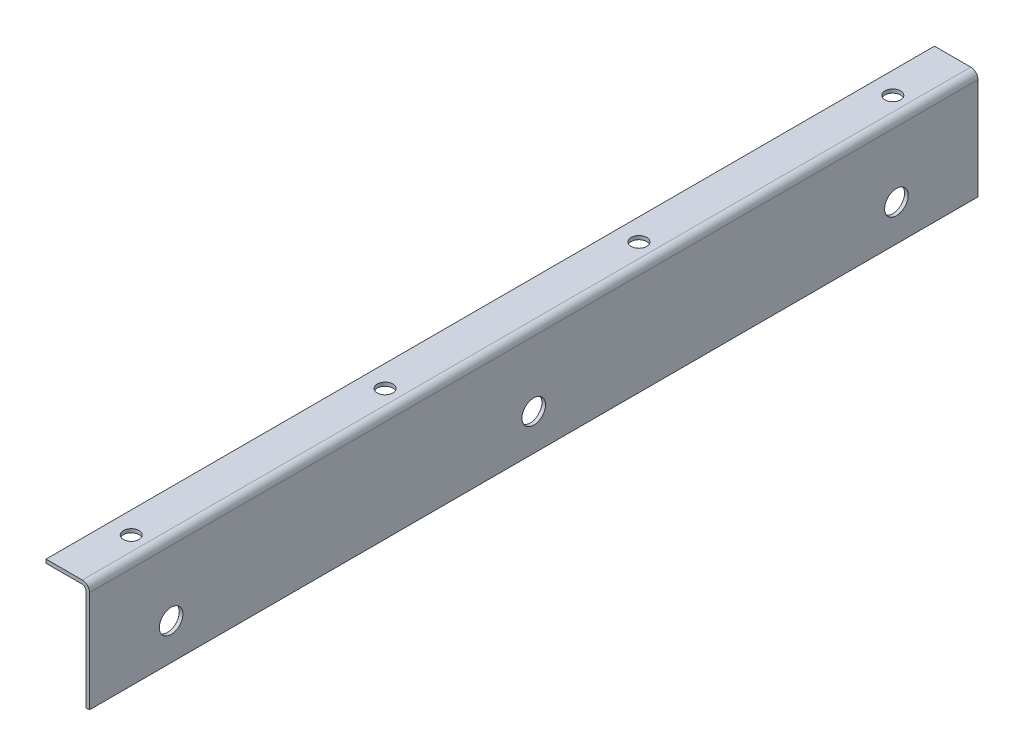
ISO-10303-21;
HEADER;
FILE_DESCRIPTION(('STEP AP214'),'2;1');
FILE_NAME('part.step','',(''),(''),'','','');
FILE_SCHEMA(('AUTOMOTIVE_DESIGN { 1 0 10303 214 1 1 1 1 }'));
ENDSEC;
DATA;
#1=APPLICATION_CONTEXT('core data for automotive mechanical design processes');
#2=APPLICATION_PROTOCOL_DEFINITION('international standard','automotive_design',2000,#1);
#3=PRODUCT_CONTEXT('',#1,'mechanical');
#4=PRODUCT('Part','Part','',(#3));
#5=PRODUCT_RELATED_PRODUCT_CATEGORY('part','',(#4));
#6=PRODUCT_DEFINITION_FORMATION('','',#4);
#7=PRODUCT_DEFINITION_CONTEXT('part definition',#1,'design');
#8=PRODUCT_DEFINITION('design','',#6,#7);
#9=PRODUCT_DEFINITION_SHAPE('','',#8);
#10=(LENGTH_UNIT() NAMED_UNIT(*) SI_UNIT(.MILLI.,.METRE.));
#11=(NAMED_UNIT(*) PLANE_ANGLE_UNIT() SI_UNIT($,.RADIAN.));
#12=(NAMED_UNIT(*) SI_UNIT($,.STERADIAN.) SOLID_ANGLE_UNIT());
#13=UNCERTAINTY_MEASURE_WITH_UNIT(LENGTH_MEASURE(1.E-05),#10,'distance_accuracy_value','');
#14=(GEOMETRIC_REPRESENTATION_CONTEXT(3) GLOBAL_UNCERTAINTY_ASSIGNED_CONTEXT((#13)) GLOBAL_UNIT_ASSIGNED_CONTEXT((#10,
#11,#12)) REPRESENTATION_CONTEXT('',''));
#15=CARTESIAN_POINT('',(0.,0.,0.));
#16=DIRECTION('',(0.,0.,1.));
#17=DIRECTION('',(1.,0.,0.));
#18=AXIS2_PLACEMENT_3D('',#15,#16,#17);
#19=CARTESIAN_POINT('',(-2.,-2.,245.));
#20=DIRECTION('',(0.,0.,-1.));
#21=DIRECTION('',(-1.,0.,0.));
#22=AXIS2_PLACEMENT_3D('',#19,#20,#21);
#23=CYLINDRICAL_SURFACE('',#22,2.);
#24=CARTESIAN_POINT('',(-2.,-2.,0.));
#25=DIRECTION('',(0.,0.,1.));
#26=DIRECTION('',(-1.,0.,0.));
#27=AXIS2_PLACEMENT_3D('',#24,#25,#26);
#28=CIRCLE('',#27,2.);
#29=CARTESIAN_POINT('',(0.,-2.00000000000001,0.));
#30=VERTEX_POINT('',#29);
#31=CARTESIAN_POINT('',(-2.00000000000001,0.,0.));
#32=VERTEX_POINT('',#31);
#33=EDGE_CURVE('E129',#30,#32,#28,.T.);
#34=ORIENTED_EDGE('',*,*,#33,.T.);
#35=DIRECTION('',(0.,0.,-1.));
#36=VECTOR('',#35,1.);
#37=CARTESIAN_POINT('',(-2.00000000000001,0.,245.));
#38=LINE('',#37,#36);
#39=CARTESIAN_POINT('',(-2.00000000000001,0.,245.));
#40=VERTEX_POINT('',#39);
#41=EDGE_CURVE('E11',#40,#32,#38,.T.);
#42=ORIENTED_EDGE('',*,*,#41,.F.);
#43=CARTESIAN_POINT('',(-2.,-2.,245.));
#44=DIRECTION('',(0.,0.,1.));
#45=DIRECTION('',(-1.,0.,0.));
#46=AXIS2_PLACEMENT_3D('',#43,#44,#45);
#47=CIRCLE('',#46,2.);
#48=CARTESIAN_POINT('',(0.,-2.00000000000001,245.));
#49=VERTEX_POINT('',#48);
#50=EDGE_CURVE('E144',#49,#40,#47,.T.);
#51=ORIENTED_EDGE('',*,*,#50,.F.);
#52=DIRECTION('',(0.,0.,-1.));
#53=VECTOR('',#52,1.);
#54=CARTESIAN_POINT('',(0.,-2.00000000000001,245.));
#55=LINE('',#54,#53);
#56=EDGE_CURVE('E125',#49,#30,#55,.T.);
#57=ORIENTED_EDGE('',*,*,#56,.T.);
#58=EDGE_LOOP('',(#34,#42,#51,#57));
#59=FACE_BOUND('',#58,.T.);
#60=ADVANCED_FACE('F31',(#59),#23,.T.);
#61=CARTESIAN_POINT('',(-2.00000000000001,0.,245.));
#62=DIRECTION('',(0.,-1.,0.));
#63=DIRECTION('',(1.,0.,0.));
#64=AXIS2_PLACEMENT_3D('',#61,#62,#63);
#65=PLANE('',#64);
#66=CARTESIAN_POINT('',(-5.99999999999997,0.,227.5));
#67=DIRECTION('',(0.,1.,0.));
#68=DIRECTION('',(-1.,0.,0.));
#69=AXIS2_PLACEMENT_3D('',#66,#67,#68);
#70=CIRCLE('',#69,2.15000000000001);
#71=CARTESIAN_POINT('',(-8.14999999999998,0.,227.5));
#72=VERTEX_POINT('',#71);
#73=EDGE_CURVE('E174',#72,#72,#70,.T.);
#74=ORIENTED_EDGE('',*,*,#73,.F.);
#75=EDGE_LOOP('',(#74));
#76=FACE_BOUND('',#75,.T.);
#77=CARTESIAN_POINT('',(-5.99999999999998,0.,157.5));
#78=DIRECTION('',(0.,1.,0.));
#79=DIRECTION('',(-1.,0.,0.));
#80=AXIS2_PLACEMENT_3D('',#77,#78,#79);
#81=CIRCLE('',#80,2.15000000000001);
#82=CARTESIAN_POINT('',(-8.14999999999999,0.,157.5));
#83=VERTEX_POINT('',#82);
#84=EDGE_CURVE('E164',#83,#83,#81,.T.);
#85=ORIENTED_EDGE('',*,*,#84,.F.);
#86=EDGE_LOOP('',(#85));
#87=FACE_BOUND('',#86,.T.);
#88=CARTESIAN_POINT('',(-5.99999999999999,0.,87.5));
#89=DIRECTION('',(0.,1.,0.));
#90=DIRECTION('',(-1.,0.,0.));
#91=AXIS2_PLACEMENT_3D('',#88,#89,#90);
#92=CIRCLE('',#91,2.15);
#93=CARTESIAN_POINT('',(-8.14999999999999,0.,87.5));
#94=VERTEX_POINT('',#93);
#95=EDGE_CURVE('E161',#94,#94,#92,.T.);
#96=ORIENTED_EDGE('',*,*,#95,.F.);
#97=EDGE_LOOP('',(#96));
#98=FACE_BOUND('',#97,.T.);
#99=CARTESIAN_POINT('',(-6.,0.,17.5));
#100=DIRECTION('',(0.,1.,0.));
#101=DIRECTION('',(-1.,0.,0.));
#102=AXIS2_PLACEMENT_3D('',#99,#100,#101);
#103=CIRCLE('',#102,2.15);
#104=CARTESIAN_POINT('',(-8.14999999999999,0.,17.5));
#105=VERTEX_POINT('',#104);
#106=EDGE_CURVE('E158',#105,#105,#103,.T.);
#107=ORIENTED_EDGE('',*,*,#106,.F.);
#108=EDGE_LOOP('',(#107));
#109=FACE_BOUND('',#108,.T.);
#110=DIRECTION('',(-1.,0.,0.));
#111=VECTOR('',#110,1.);
#112=CARTESIAN_POINT('',(-2.00000000000001,0.,0.));
#113=LINE('',#112,#111);
#114=CARTESIAN_POINT('',(-12.,0.,0.));
#115=VERTEX_POINT('',#114);
#116=EDGE_CURVE('E132',#32,#115,#113,.T.);
#117=ORIENTED_EDGE('',*,*,#116,.T.);
#118=DIRECTION('',(0.,0.,-1.));
#119=VECTOR('',#118,1.);
#120=CARTESIAN_POINT('',(-12.,0.,245.));
#121=LINE('',#120,#119);
#122=CARTESIAN_POINT('',(-12.,0.,245.));
#123=VERTEX_POINT('',#122);
#124=EDGE_CURVE('E40',#123,#115,#121,.T.);
#125=ORIENTED_EDGE('',*,*,#124,.F.);
#126=DIRECTION('',(-1.,0.,0.));
#127=VECTOR('',#126,1.);
#128=CARTESIAN_POINT('',(-2.00000000000001,0.,245.));
#129=LINE('',#128,#127);
#130=EDGE_CURVE('E92',#40,#123,#129,.T.);
#131=ORIENTED_EDGE('',*,*,#130,.F.);
#132=ORIENTED_EDGE('',*,*,#41,.T.);
#133=EDGE_LOOP('',(#117,#125,#131,#132));
#134=FACE_BOUND('',#133,.T.);
#135=ADVANCED_FACE('F216',(#76,#87,#98,#109,#134),#65,.F.);
#136=CARTESIAN_POINT('',(-12.,0.,245.));
#137=DIRECTION('',(1.,0.,0.));
#138=DIRECTION('',(0.,0.,-1.));
#139=AXIS2_PLACEMENT_3D('',#136,#137,#138);
#140=PLANE('',#139);
#141=DIRECTION('',(0.,-1.,0.));
#142=VECTOR('',#141,1.);
#143=CARTESIAN_POINT('',(-12.,0.,0.));
#144=LINE('',#143,#142);
#145=CARTESIAN_POINT('',(-12.,-1.,0.));
#146=VERTEX_POINT('',#145);
#147=EDGE_CURVE('E135',#115,#146,#144,.T.);
#148=ORIENTED_EDGE('',*,*,#147,.T.);
#149=DIRECTION('',(0.,0.,-1.));
#150=VECTOR('',#149,1.);
#151=CARTESIAN_POINT('',(-12.,-1.,245.));
#152=LINE('',#151,#150);
#153=CARTESIAN_POINT('',(-12.,-1.,245.));
#154=VERTEX_POINT('',#153);
#155=EDGE_CURVE('E151',#154,#146,#152,.T.);
#156=ORIENTED_EDGE('',*,*,#155,.F.);
#157=DIRECTION('',(0.,-1.,0.));
#158=VECTOR('',#157,1.);
#159=CARTESIAN_POINT('',(-12.,0.,245.));
#160=LINE('',#159,#158);
#161=EDGE_CURVE('E182',#123,#154,#160,.T.);
#162=ORIENTED_EDGE('',*,*,#161,.F.);
#163=ORIENTED_EDGE('',*,*,#124,.T.);
#164=EDGE_LOOP('',(#148,#156,#162,#163));
#165=FACE_BOUND('',#164,.T.);
#166=ADVANCED_FACE('F220',(#165),#140,.F.);
#167=CARTESIAN_POINT('',(-2.00000000000001,-1.,245.));
#168=DIRECTION('',(0.,1.,0.));
#169=DIRECTION('',(-1.,0.,0.));
#170=AXIS2_PLACEMENT_3D('',#167,#168,#169);
#171=PLANE('',#170);
#172=CARTESIAN_POINT('',(-5.99999999999997,-1.,227.5));
#173=DIRECTION('',(0.,1.,0.));
#174=DIRECTION('',(-1.,0.,0.));
#175=AXIS2_PLACEMENT_3D('',#172,#173,#174);
#176=CIRCLE('',#175,2.15000000000001);
#177=CARTESIAN_POINT('',(-8.14999999999998,-1.,227.5));
#178=VERTEX_POINT('',#177);
#179=EDGE_CURVE('E34',#178,#178,#176,.T.);
#180=ORIENTED_EDGE('',*,*,#179,.T.);
#181=EDGE_LOOP('',(#180));
#182=FACE_BOUND('',#181,.T.);
#183=CARTESIAN_POINT('',(-5.99999999999998,-1.,157.5));
#184=DIRECTION('',(0.,1.,0.));
#185=DIRECTION('',(-1.,0.,0.));
#186=AXIS2_PLACEMENT_3D('',#183,#184,#185);
#187=CIRCLE('',#186,2.15000000000001);
#188=CARTESIAN_POINT('',(-8.14999999999999,-1.,157.5));
#189=VERTEX_POINT('',#188);
#190=EDGE_CURVE('E162',#189,#189,#187,.T.);
#191=ORIENTED_EDGE('',*,*,#190,.T.);
#192=EDGE_LOOP('',(#191));
#193=FACE_BOUND('',#192,.T.);
#194=CARTESIAN_POINT('',(-5.99999999999999,-1.,87.5));
#195=DIRECTION('',(0.,1.,0.));
#196=DIRECTION('',(-1.,0.,0.));
#197=AXIS2_PLACEMENT_3D('',#194,#195,#196);
#198=CIRCLE('',#197,2.15);
#199=CARTESIAN_POINT('',(-8.14999999999999,-1.,87.5));
#200=VERTEX_POINT('',#199);
#201=EDGE_CURVE('E159',#200,#200,#198,.T.);
#202=ORIENTED_EDGE('',*,*,#201,.T.);
#203=EDGE_LOOP('',(#202));
#204=FACE_BOUND('',#203,.T.);
#205=CARTESIAN_POINT('',(-5.99999999999999,-1.,17.5));
#206=DIRECTION('',(0.,1.,0.));
#207=DIRECTION('',(-1.,0.,0.));
#208=AXIS2_PLACEMENT_3D('',#205,#206,#207);
#209=CIRCLE('',#208,2.15);
#210=CARTESIAN_POINT('',(-8.14999999999999,-1.,17.5));
#211=VERTEX_POINT('',#210);
#212=EDGE_CURVE('E133',#211,#211,#209,.T.);
#213=ORIENTED_EDGE('',*,*,#212,.T.);
#214=EDGE_LOOP('',(#213));
#215=FACE_BOUND('',#214,.T.);
#216=DIRECTION('',(1.,0.,0.));
#217=VECTOR('',#216,1.);
#218=CARTESIAN_POINT('',(-2.00000000000001,-1.,0.));
#219=LINE('',#218,#217);
#220=CARTESIAN_POINT('',(-2.00000000000001,-1.,0.));
#221=VERTEX_POINT('',#220);
#222=EDGE_CURVE('E137',#146,#221,#219,.T.);
#223=ORIENTED_EDGE('',*,*,#222,.T.);
#224=DIRECTION('',(0.,0.,-1.));
#225=VECTOR('',#224,1.);
#226=CARTESIAN_POINT('',(-2.00000000000001,-1.,245.));
#227=LINE('',#226,#225);
#228=CARTESIAN_POINT('',(-2.00000000000001,-1.,245.));
#229=VERTEX_POINT('',#228);
#230=EDGE_CURVE('E148',#229,#221,#227,.T.);
#231=ORIENTED_EDGE('',*,*,#230,.F.);
#232=DIRECTION('',(1.,0.,0.));
#233=VECTOR('',#232,1.);
#234=CARTESIAN_POINT('',(-2.00000000000001,-1.,245.));
#235=LINE('',#234,#233);
#236=EDGE_CURVE('E184',#154,#229,#235,.T.);
#237=ORIENTED_EDGE('',*,*,#236,.F.);
#238=ORIENTED_EDGE('',*,*,#155,.T.);
#239=EDGE_LOOP('',(#223,#231,#237,#238));
#240=FACE_BOUND('',#239,.T.);
#241=ADVANCED_FACE('F190',(#182,#193,#204,#215,#240),#171,.F.);
#242=CARTESIAN_POINT('',(-2.,-2.,245.));
#243=DIRECTION('',(0.,0.,-1.));
#244=DIRECTION('',(-1.,0.,0.));
#245=AXIS2_PLACEMENT_3D('',#242,#243,#244);
#246=CYLINDRICAL_SURFACE('',#245,1.);
#247=CARTESIAN_POINT('',(-2.,-2.,0.));
#248=DIRECTION('',(0.,0.,-1.));
#249=DIRECTION('',(-1.,0.,0.));
#250=AXIS2_PLACEMENT_3D('',#247,#248,#249);
#251=CIRCLE('',#250,1.);
#252=CARTESIAN_POINT('',(-1.,-2.00000000000001,0.));
#253=VERTEX_POINT('',#252);
#254=EDGE_CURVE('E139',#221,#253,#251,.T.);
#255=ORIENTED_EDGE('',*,*,#254,.T.);
#256=DIRECTION('',(0.,0.,-1.));
#257=VECTOR('',#256,1.);
#258=CARTESIAN_POINT('',(-1.,-2.00000000000001,245.));
#259=LINE('',#258,#257);
#260=CARTESIAN_POINT('',(-1.,-2.00000000000001,245.));
#261=VERTEX_POINT('',#260);
#262=EDGE_CURVE('E120',#261,#253,#259,.T.);
#263=ORIENTED_EDGE('',*,*,#262,.F.);
#264=CARTESIAN_POINT('',(-2.,-2.,245.));
#265=DIRECTION('',(0.,0.,-1.));
#266=DIRECTION('',(-1.,0.,0.));
#267=AXIS2_PLACEMENT_3D('',#264,#265,#266);
#268=CIRCLE('',#267,1.);
#269=EDGE_CURVE('E111',#229,#261,#268,.T.);
#270=ORIENTED_EDGE('',*,*,#269,.F.);
#271=ORIENTED_EDGE('',*,*,#230,.T.);
#272=EDGE_LOOP('',(#255,#263,#270,#271));
#273=FACE_BOUND('',#272,.T.);
#274=ADVANCED_FACE('F194',(#273),#246,.F.);
#275=CARTESIAN_POINT('',(-1.,-2.00000000000001,245.));
#276=DIRECTION('',(1.,0.,0.));
#277=DIRECTION('',(0.,0.,-1.));
#278=AXIS2_PLACEMENT_3D('',#275,#276,#277);
#279=PLANE('',#278);
#280=CARTESIAN_POINT('',(-1.,-20.,222.5));
#281=DIRECTION('',(1.,0.,0.));
#282=DIRECTION('',(0.,0.,-1.));
#283=AXIS2_PLACEMENT_3D('',#280,#281,#282);
#284=CIRCLE('',#283,3.24999999999998);
#285=CARTESIAN_POINT('',(-1.,-20.,219.25));
#286=VERTEX_POINT('',#285);
#287=EDGE_CURVE('E242',#286,#286,#284,.T.);
#288=ORIENTED_EDGE('',*,*,#287,.T.);
#289=EDGE_LOOP('',(#288));
#290=FACE_BOUND('',#289,.T.);
#291=CARTESIAN_POINT('',(-1.,-20.,22.5));
#292=DIRECTION('',(1.,0.,0.));
#293=DIRECTION('',(0.,0.,-1.));
#294=AXIS2_PLACEMENT_3D('',#291,#292,#293);
#295=CIRCLE('',#294,3.25);
#296=CARTESIAN_POINT('',(-1.,-20.,19.25));
#297=VERTEX_POINT('',#296);
#298=EDGE_CURVE('E246',#297,#297,#295,.T.);
#299=ORIENTED_EDGE('',*,*,#298,.T.);
#300=EDGE_LOOP('',(#299));
#301=FACE_BOUND('',#300,.T.);
#302=CARTESIAN_POINT('',(-1.,-20.,122.5));
#303=DIRECTION('',(1.,0.,0.));
#304=DIRECTION('',(0.,0.,-1.));
#305=AXIS2_PLACEMENT_3D('',#302,#303,#304);
#306=CIRCLE('',#305,3.25000000000001);
#307=CARTESIAN_POINT('',(-1.,-20.,119.25));
#308=VERTEX_POINT('',#307);
#309=EDGE_CURVE('E249',#308,#308,#306,.T.);
#310=ORIENTED_EDGE('',*,*,#309,.T.);
#311=EDGE_LOOP('',(#310));
#312=FACE_BOUND('',#311,.T.);
#313=DIRECTION('',(0.,-1.,0.));
#314=VECTOR('',#313,1.);
#315=CARTESIAN_POINT('',(-1.,-2.00000000000001,0.));
#316=LINE('',#315,#314);
#317=CARTESIAN_POINT('',(-1.,-30.,0.));
#318=VERTEX_POINT('',#317);
#319=EDGE_CURVE('E119',#253,#318,#316,.T.);
#320=ORIENTED_EDGE('',*,*,#319,.T.);
#321=DIRECTION('',(0.,0.,-1.));
#322=VECTOR('',#321,1.);
#323=CARTESIAN_POINT('',(-1.,-30.,245.));
#324=LINE('',#323,#322);
#325=CARTESIAN_POINT('',(-1.,-30.,245.));
#326=VERTEX_POINT('',#325);
#327=EDGE_CURVE('E116',#326,#318,#324,.T.);
#328=ORIENTED_EDGE('',*,*,#327,.F.);
#329=DIRECTION('',(0.,-1.,0.));
#330=VECTOR('',#329,1.);
#331=CARTESIAN_POINT('',(-1.,-2.00000000000001,245.));
#332=LINE('',#331,#330);
#333=EDGE_CURVE('E105',#261,#326,#332,.T.);
#334=ORIENTED_EDGE('',*,*,#333,.F.);
#335=ORIENTED_EDGE('',*,*,#262,.T.);
#336=EDGE_LOOP('',(#320,#328,#334,#335));
#337=FACE_BOUND('',#336,.T.);
#338=ADVANCED_FACE('F117',(#290,#301,#312,#337),#279,.F.);
#339=CARTESIAN_POINT('',(-1.,-30.,245.));
#340=DIRECTION('',(0.,1.,0.));
#341=DIRECTION('',(0.,0.,1.));
#342=AXIS2_PLACEMENT_3D('',#339,#340,#341);
#343=PLANE('',#342);
#344=DIRECTION('',(1.,0.,0.));
#345=VECTOR('',#344,1.);
#346=CARTESIAN_POINT('',(-1.,-30.,0.));
#347=LINE('',#346,#345);
#348=CARTESIAN_POINT('',(0.,-30.,0.));
#349=VERTEX_POINT('',#348);
#350=EDGE_CURVE('E78',#318,#349,#347,.T.);
#351=ORIENTED_EDGE('',*,*,#350,.T.);
#352=DIRECTION('',(0.,0.,-1.));
#353=VECTOR('',#352,1.);
#354=CARTESIAN_POINT('',(0.,-30.,245.));
#355=LINE('',#354,#353);
#356=CARTESIAN_POINT('',(0.,-30.,245.));
#357=VERTEX_POINT('',#356);
#358=EDGE_CURVE('E121',#357,#349,#355,.T.);
#359=ORIENTED_EDGE('',*,*,#358,.F.);
#360=DIRECTION('',(1.,0.,0.));
#361=VECTOR('',#360,1.);
#362=CARTESIAN_POINT('',(-1.,-30.,245.));
#363=LINE('',#362,#361);
#364=EDGE_CURVE('E109',#326,#357,#363,.T.);
#365=ORIENTED_EDGE('',*,*,#364,.F.);
#366=ORIENTED_EDGE('',*,*,#327,.T.);
#367=EDGE_LOOP('',(#351,#359,#365,#366));
#368=FACE_BOUND('',#367,.T.);
#369=ADVANCED_FACE('F123',(#368),#343,.F.);
#370=CARTESIAN_POINT('',(0.,-2.00000000000001,245.));
#371=DIRECTION('',(-1.,0.,0.));
#372=DIRECTION('',(0.,-1.,0.));
#373=AXIS2_PLACEMENT_3D('',#370,#371,#372);
#374=PLANE('',#373);
#375=CARTESIAN_POINT('',(0.,-20.,222.5));
#376=DIRECTION('',(1.,0.,0.));
#377=DIRECTION('',(0.,-1.,0.));
#378=AXIS2_PLACEMENT_3D('',#375,#376,#377);
#379=CIRCLE('',#378,3.24999999999998);
#380=CARTESIAN_POINT('',(0.,-23.25,222.5));
#381=VERTEX_POINT('',#380);
#382=EDGE_CURVE('E261',#381,#381,#379,.T.);
#383=ORIENTED_EDGE('',*,*,#382,.F.);
#384=EDGE_LOOP('',(#383));
#385=FACE_BOUND('',#384,.T.);
#386=CARTESIAN_POINT('',(0.,-20.,22.5));
#387=DIRECTION('',(1.,0.,0.));
#388=DIRECTION('',(0.,1.,0.));
#389=AXIS2_PLACEMENT_3D('',#386,#387,#388);
#390=CIRCLE('',#389,3.25);
#391=CARTESIAN_POINT('',(0.,-16.75,22.5));
#392=VERTEX_POINT('',#391);
#393=EDGE_CURVE('E257',#392,#392,#390,.T.);
#394=ORIENTED_EDGE('',*,*,#393,.F.);
#395=EDGE_LOOP('',(#394));
#396=FACE_BOUND('',#395,.T.);
#397=CARTESIAN_POINT('',(0.,-20.,122.5));
#398=DIRECTION('',(1.,0.,0.));
#399=DIRECTION('',(0.,1.,0.));
#400=AXIS2_PLACEMENT_3D('',#397,#398,#399);
#401=CIRCLE('',#400,3.25000000000001);
#402=CARTESIAN_POINT('',(0.,-16.75,122.5));
#403=VERTEX_POINT('',#402);
#404=EDGE_CURVE('E251',#403,#403,#401,.T.);
#405=ORIENTED_EDGE('',*,*,#404,.F.);
#406=EDGE_LOOP('',(#405));
#407=FACE_BOUND('',#406,.T.);
#408=DIRECTION('',(0.,1.,0.));
#409=VECTOR('',#408,1.);
#410=CARTESIAN_POINT('',(0.,-2.00000000000001,0.));
#411=LINE('',#410,#409);
#412=EDGE_CURVE('E84',#349,#30,#411,.T.);
#413=ORIENTED_EDGE('',*,*,#412,.T.);
#414=ORIENTED_EDGE('',*,*,#56,.F.);
#415=DIRECTION('',(0.,1.,0.));
#416=VECTOR('',#415,1.);
#417=CARTESIAN_POINT('',(0.,-2.00000000000001,245.));
#418=LINE('',#417,#416);
#419=EDGE_CURVE('E49',#357,#49,#418,.T.);
#420=ORIENTED_EDGE('',*,*,#419,.F.);
#421=ORIENTED_EDGE('',*,*,#358,.T.);
#422=EDGE_LOOP('',(#413,#414,#420,#421));
#423=FACE_BOUND('',#422,.T.);
#424=ADVANCED_FACE('F202',(#385,#396,#407,#423),#374,.F.);
#425=CARTESIAN_POINT('',(-2.,-2.,245.));
#426=DIRECTION('',(0.,0.,-1.));
#427=DIRECTION('',(-1.,0.,0.));
#428=AXIS2_PLACEMENT_3D('',#425,#426,#427);
#429=PLANE('',#428);
#430=ORIENTED_EDGE('',*,*,#50,.T.);
#431=ORIENTED_EDGE('',*,*,#130,.T.);
#432=ORIENTED_EDGE('',*,*,#161,.T.);
#433=ORIENTED_EDGE('',*,*,#236,.T.);
#434=ORIENTED_EDGE('',*,*,#269,.T.);
#435=ORIENTED_EDGE('',*,*,#333,.T.);
#436=ORIENTED_EDGE('',*,*,#364,.T.);
#437=ORIENTED_EDGE('',*,*,#419,.T.);
#438=EDGE_LOOP('',(#430,#431,#432,#433,#434,#435,#436,#437));
#439=FACE_BOUND('',#438,.T.);
#440=ADVANCED_FACE('F107',(#439),#429,.F.);
#441=CARTESIAN_POINT('',(-2.,-2.,0.));
#442=DIRECTION('',(0.,0.,-1.));
#443=DIRECTION('',(-1.,0.,0.));
#444=AXIS2_PLACEMENT_3D('',#441,#442,#443);
#445=PLANE('',#444);
#446=ORIENTED_EDGE('',*,*,#33,.F.);
#447=ORIENTED_EDGE('',*,*,#412,.F.);
#448=ORIENTED_EDGE('',*,*,#350,.F.);
#449=ORIENTED_EDGE('',*,*,#319,.F.);
#450=ORIENTED_EDGE('',*,*,#254,.F.);
#451=ORIENTED_EDGE('',*,*,#222,.F.);
#452=ORIENTED_EDGE('',*,*,#147,.F.);
#453=ORIENTED_EDGE('',*,*,#116,.F.);
#454=EDGE_LOOP('',(#446,#447,#448,#449,#450,#451,#452,#453));
#455=FACE_BOUND('',#454,.T.);
#456=ADVANCED_FACE('F197',(#455),#445,.T.);
#457=CARTESIAN_POINT('',(-5.99999999999997,-245.,17.5));
#458=DIRECTION('',(0.,1.,0.));
#459=DIRECTION('',(-1.,0.,0.));
#460=AXIS2_PLACEMENT_3D('',#457,#458,#459);
#461=CYLINDRICAL_SURFACE('',#460,2.15);
#462=ORIENTED_EDGE('',*,*,#106,.T.);
#463=EDGE_LOOP('',(#462));
#464=FACE_BOUND('',#463,.T.);
#465=ORIENTED_EDGE('',*,*,#212,.F.);
#466=EDGE_LOOP('',(#465));
#467=FACE_BOUND('',#466,.T.);
#468=ADVANCED_FACE('F289',(#464,#467),#461,.F.);
#469=CARTESIAN_POINT('',(-5.99999999999996,-245.,87.5));
#470=DIRECTION('',(0.,1.,0.));
#471=DIRECTION('',(-1.,0.,0.));
#472=AXIS2_PLACEMENT_3D('',#469,#470,#471);
#473=CYLINDRICAL_SURFACE('',#472,2.15);
#474=ORIENTED_EDGE('',*,*,#95,.T.);
#475=EDGE_LOOP('',(#474));
#476=FACE_BOUND('',#475,.T.);
#477=ORIENTED_EDGE('',*,*,#201,.F.);
#478=EDGE_LOOP('',(#477));
#479=FACE_BOUND('',#478,.T.);
#480=ADVANCED_FACE('F286',(#476,#479),#473,.F.);
#481=CARTESIAN_POINT('',(-5.99999999999995,-245.,157.5));
#482=DIRECTION('',(0.,1.,0.));
#483=DIRECTION('',(-1.,0.,0.));
#484=AXIS2_PLACEMENT_3D('',#481,#482,#483);
#485=CYLINDRICAL_SURFACE('',#484,2.15000000000001);
#486=ORIENTED_EDGE('',*,*,#84,.T.);
#487=EDGE_LOOP('',(#486));
#488=FACE_BOUND('',#487,.T.);
#489=ORIENTED_EDGE('',*,*,#190,.F.);
#490=EDGE_LOOP('',(#489));
#491=FACE_BOUND('',#490,.T.);
#492=ADVANCED_FACE('F282',(#488,#491),#485,.F.);
#493=CARTESIAN_POINT('',(-5.99999999999994,-245.,227.5));
#494=DIRECTION('',(0.,1.,0.));
#495=DIRECTION('',(-1.,0.,0.));
#496=AXIS2_PLACEMENT_3D('',#493,#494,#495);
#497=CYLINDRICAL_SURFACE('',#496,2.15000000000001);
#498=ORIENTED_EDGE('',*,*,#73,.T.);
#499=EDGE_LOOP('',(#498));
#500=FACE_BOUND('',#499,.T.);
#501=ORIENTED_EDGE('',*,*,#179,.F.);
#502=EDGE_LOOP('',(#501));
#503=FACE_BOUND('',#502,.T.);
#504=ADVANCED_FACE('F278',(#500,#503),#497,.F.);
#505=CARTESIAN_POINT('',(-245.,-20.,122.5));
#506=DIRECTION('',(1.,0.,0.));
#507=DIRECTION('',(0.,1.,0.));
#508=AXIS2_PLACEMENT_3D('',#505,#506,#507);
#509=CYLINDRICAL_SURFACE('',#508,3.25000000000001);
#510=ORIENTED_EDGE('',*,*,#404,.T.);
#511=EDGE_LOOP('',(#510));
#512=FACE_BOUND('',#511,.T.);
#513=ORIENTED_EDGE('',*,*,#309,.F.);
#514=EDGE_LOOP('',(#513));
#515=FACE_BOUND('',#514,.T.);
#516=ADVANCED_FACE('F272',(#512,#515),#509,.F.);
#517=CARTESIAN_POINT('',(-245.,-20.,22.5));
#518=DIRECTION('',(1.,0.,0.));
#519=DIRECTION('',(0.,1.,0.));
#520=AXIS2_PLACEMENT_3D('',#517,#518,#519);
#521=CYLINDRICAL_SURFACE('',#520,3.25);
#522=ORIENTED_EDGE('',*,*,#393,.T.);
#523=EDGE_LOOP('',(#522));
#524=FACE_BOUND('',#523,.T.);
#525=ORIENTED_EDGE('',*,*,#298,.F.);
#526=EDGE_LOOP('',(#525));
#527=FACE_BOUND('',#526,.T.);
#528=ADVANCED_FACE('F267',(#524,#527),#521,.F.);
#529=CARTESIAN_POINT('',(-245.,-20.0000000000001,222.5));
#530=DIRECTION('',(1.,0.,0.));
#531=DIRECTION('',(0.,1.,0.));
#532=AXIS2_PLACEMENT_3D('',#529,#530,#531);
#533=CYLINDRICAL_SURFACE('',#532,3.24999999999998);
#534=ORIENTED_EDGE('',*,*,#382,.T.);
#535=EDGE_LOOP('',(#534));
#536=FACE_BOUND('',#535,.T.);
#537=ORIENTED_EDGE('',*,*,#287,.F.);
#538=EDGE_LOOP('',(#537));
#539=FACE_BOUND('',#538,.T.);
#540=ADVANCED_FACE('F264',(#536,#539),#533,.F.);
#541=CLOSED_SHELL('',(#60,#135,#166,#241,#274,#338,#369,#424,#440,#456,#468,#480,#492,#504,#516,
#528,#540));
#542=MANIFOLD_SOLID_BREP('B2',#541);
#543=ADVANCED_BREP_SHAPE_REPRESENTATION('',(#18,#542),#14);
#544=SHAPE_DEFINITION_REPRESENTATION(#9,#543);
ENDSEC;
END-ISO-10303-21;
